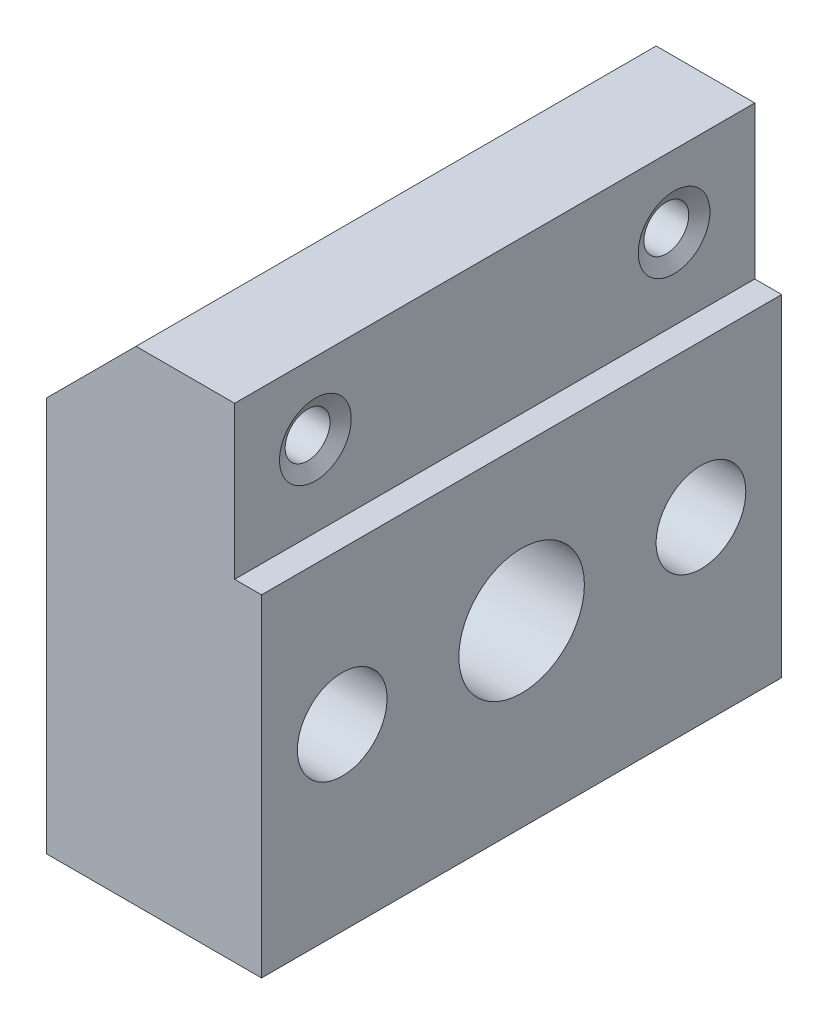
ISO-10303-21;
HEADER;
FILE_DESCRIPTION(('STEP AP214'),'2;1');
FILE_NAME('part.step','',(''),(''),'','','');
FILE_SCHEMA(('AUTOMOTIVE_DESIGN { 1 0 10303 214 1 1 1 1 }'));
ENDSEC;
DATA;
#1=APPLICATION_CONTEXT('core data for automotive mechanical design processes');
#2=APPLICATION_PROTOCOL_DEFINITION('international standard','automotive_design',2000,#1);
#3=PRODUCT_CONTEXT('',#1,'mechanical');
#4=PRODUCT('Part','Part','',(#3));
#5=PRODUCT_RELATED_PRODUCT_CATEGORY('part','',(#4));
#6=PRODUCT_DEFINITION_FORMATION('','',#4);
#7=PRODUCT_DEFINITION_CONTEXT('part definition',#1,'design');
#8=PRODUCT_DEFINITION('design','',#6,#7);
#9=PRODUCT_DEFINITION_SHAPE('','',#8);
#10=(LENGTH_UNIT() NAMED_UNIT(*) SI_UNIT(.MILLI.,.METRE.));
#11=(NAMED_UNIT(*) PLANE_ANGLE_UNIT() SI_UNIT($,.RADIAN.));
#12=(NAMED_UNIT(*) SI_UNIT($,.STERADIAN.) SOLID_ANGLE_UNIT());
#13=UNCERTAINTY_MEASURE_WITH_UNIT(LENGTH_MEASURE(1.E-05),#10,'distance_accuracy_value','');
#14=(GEOMETRIC_REPRESENTATION_CONTEXT(3) GLOBAL_UNCERTAINTY_ASSIGNED_CONTEXT((#13)) GLOBAL_UNIT_ASSIGNED_CONTEXT((#10,
#11,#12)) REPRESENTATION_CONTEXT('',''));
#15=CARTESIAN_POINT('',(0.,0.,0.));
#16=DIRECTION('',(0.,0.,1.));
#17=DIRECTION('',(1.,0.,0.));
#18=AXIS2_PLACEMENT_3D('',#15,#16,#17);
#19=CARTESIAN_POINT('',(-24.,0.,58.));
#20=DIRECTION('',(0.,1.,0.));
#21=DIRECTION('',(0.,0.,1.));
#22=AXIS2_PLACEMENT_3D('',#19,#20,#21);
#23=PLANE('',#22);
#24=DIRECTION('',(1.,0.,0.));
#25=VECTOR('',#24,1.);
#26=CARTESIAN_POINT('',(-24.,0.,0.));
#27=LINE('',#26,#25);
#28=CARTESIAN_POINT('',(-24.,0.,0.));
#29=VERTEX_POINT('',#28);
#30=CARTESIAN_POINT('',(0.,0.,0.));
#31=VERTEX_POINT('',#30);
#32=EDGE_CURVE('E131',#29,#31,#27,.T.);
#33=ORIENTED_EDGE('',*,*,#32,.T.);
#34=DIRECTION('',(0.,0.,-1.));
#35=VECTOR('',#34,1.);
#36=CARTESIAN_POINT('',(0.,0.,58.));
#37=LINE('',#36,#35);
#38=CARTESIAN_POINT('',(0.,0.,58.));
#39=VERTEX_POINT('',#38);
#40=EDGE_CURVE('E11',#39,#31,#37,.T.);
#41=ORIENTED_EDGE('',*,*,#40,.F.);
#42=DIRECTION('',(1.,0.,0.));
#43=VECTOR('',#42,1.);
#44=CARTESIAN_POINT('',(-24.,0.,58.));
#45=LINE('',#44,#43);
#46=CARTESIAN_POINT('',(-24.,0.,58.));
#47=VERTEX_POINT('',#46);
#48=EDGE_CURVE('E144',#47,#39,#45,.T.);
#49=ORIENTED_EDGE('',*,*,#48,.F.);
#50=DIRECTION('',(0.,0.,-1.));
#51=VECTOR('',#50,1.);
#52=CARTESIAN_POINT('',(-24.,0.,58.));
#53=LINE('',#52,#51);
#54=EDGE_CURVE('E127',#47,#29,#53,.T.);
#55=ORIENTED_EDGE('',*,*,#54,.T.);
#56=EDGE_LOOP('',(#33,#41,#49,#55));
#57=FACE_BOUND('',#56,.T.);
#58=ADVANCED_FACE('F38',(#57),#23,.F.);
#59=CARTESIAN_POINT('',(0.,0.,58.));
#60=DIRECTION('',(-1.,0.,0.));
#61=DIRECTION('',(0.,0.,1.));
#62=AXIS2_PLACEMENT_3D('',#59,#60,#61);
#63=PLANE('',#62);
#64=CARTESIAN_POINT('',(0.,20.,29.));
#65=DIRECTION('',(1.,0.,0.));
#66=DIRECTION('',(0.,0.,-1.));
#67=AXIS2_PLACEMENT_3D('',#64,#65,#66);
#68=CIRCLE('',#67,7.);
#69=CARTESIAN_POINT('',(0.,20.,22.));
#70=VERTEX_POINT('',#69);
#71=EDGE_CURVE('E181',#70,#70,#68,.T.);
#72=ORIENTED_EDGE('',*,*,#71,.F.);
#73=EDGE_LOOP('',(#72));
#74=FACE_BOUND('',#73,.T.);
#75=CARTESIAN_POINT('',(0.,20.,49.));
#76=DIRECTION('',(1.,0.,0.));
#77=DIRECTION('',(0.,0.,1.));
#78=AXIS2_PLACEMENT_3D('',#75,#76,#77);
#79=CIRCLE('',#78,5.);
#80=CARTESIAN_POINT('',(0.,20.,54.));
#81=VERTEX_POINT('',#80);
#82=EDGE_CURVE('E173',#81,#81,#79,.T.);
#83=ORIENTED_EDGE('',*,*,#82,.F.);
#84=EDGE_LOOP('',(#83));
#85=FACE_BOUND('',#84,.T.);
#86=CARTESIAN_POINT('',(0.,20.,9.));
#87=DIRECTION('',(1.,0.,0.));
#88=DIRECTION('',(0.,0.,-1.));
#89=AXIS2_PLACEMENT_3D('',#86,#87,#88);
#90=CIRCLE('',#89,5.);
#91=CARTESIAN_POINT('',(0.,20.,4.));
#92=VERTEX_POINT('',#91);
#93=EDGE_CURVE('E167',#92,#92,#90,.T.);
#94=ORIENTED_EDGE('',*,*,#93,.F.);
#95=EDGE_LOOP('',(#94));
#96=FACE_BOUND('',#95,.T.);
#97=DIRECTION('',(0.,1.,0.));
#98=VECTOR('',#97,1.);
#99=CARTESIAN_POINT('',(0.,0.,0.));
#100=LINE('',#99,#98);
#101=CARTESIAN_POINT('',(0.,37.,0.));
#102=VERTEX_POINT('',#101);
#103=EDGE_CURVE('E134',#31,#102,#100,.T.);
#104=ORIENTED_EDGE('',*,*,#103,.T.);
#105=DIRECTION('',(0.,0.,-1.));
#106=VECTOR('',#105,1.);
#107=CARTESIAN_POINT('',(0.,37.,58.));
#108=LINE('',#107,#106);
#109=CARTESIAN_POINT('',(0.,37.,58.));
#110=VERTEX_POINT('',#109);
#111=EDGE_CURVE('E46',#110,#102,#108,.T.);
#112=ORIENTED_EDGE('',*,*,#111,.F.);
#113=DIRECTION('',(0.,1.,0.));
#114=VECTOR('',#113,1.);
#115=CARTESIAN_POINT('',(0.,0.,58.));
#116=LINE('',#115,#114);
#117=EDGE_CURVE('E95',#39,#110,#116,.T.);
#118=ORIENTED_EDGE('',*,*,#117,.F.);
#119=ORIENTED_EDGE('',*,*,#40,.T.);
#120=EDGE_LOOP('',(#104,#112,#118,#119));
#121=FACE_BOUND('',#120,.T.);
#122=ADVANCED_FACE('F228',(#74,#85,#96,#121),#63,.F.);
#123=CARTESIAN_POINT('',(0.,37.,58.));
#124=DIRECTION('',(0.,-1.,0.));
#125=DIRECTION('',(0.,0.,-1.));
#126=AXIS2_PLACEMENT_3D('',#123,#124,#125);
#127=PLANE('',#126);
#128=DIRECTION('',(-1.,0.,0.));
#129=VECTOR('',#128,1.);
#130=CARTESIAN_POINT('',(0.,37.,0.));
#131=LINE('',#130,#129);
#132=CARTESIAN_POINT('',(-3.,37.,0.));
#133=VERTEX_POINT('',#132);
#134=EDGE_CURVE('E137',#102,#133,#131,.T.);
#135=ORIENTED_EDGE('',*,*,#134,.T.);
#136=DIRECTION('',(0.,0.,-1.));
#137=VECTOR('',#136,1.);
#138=CARTESIAN_POINT('',(-3.,37.,58.));
#139=LINE('',#138,#137);
#140=CARTESIAN_POINT('',(-3.,37.,58.));
#141=VERTEX_POINT('',#140);
#142=EDGE_CURVE('E148',#141,#133,#139,.T.);
#143=ORIENTED_EDGE('',*,*,#142,.F.);
#144=DIRECTION('',(-1.,0.,0.));
#145=VECTOR('',#144,1.);
#146=CARTESIAN_POINT('',(0.,37.,58.));
#147=LINE('',#146,#145);
#148=EDGE_CURVE('E156',#110,#141,#147,.T.);
#149=ORIENTED_EDGE('',*,*,#148,.F.);
#150=ORIENTED_EDGE('',*,*,#111,.T.);
#151=EDGE_LOOP('',(#135,#143,#149,#150));
#152=FACE_BOUND('',#151,.T.);
#153=ADVANCED_FACE('F154',(#152),#127,.F.);
#154=CARTESIAN_POINT('',(-3.,37.,58.));
#155=DIRECTION('',(-1.,0.,0.));
#156=DIRECTION('',(0.,0.,1.));
#157=AXIS2_PLACEMENT_3D('',#154,#155,#156);
#158=PLANE('',#157);
#159=CARTESIAN_POINT('',(-3.,46.,49.));
#160=DIRECTION('',(1.,0.,0.));
#161=DIRECTION('',(0.,0.,-1.));
#162=AXIS2_PLACEMENT_3D('',#159,#160,#161);
#163=CIRCLE('',#162,4.);
#164=CARTESIAN_POINT('',(-3.,46.,45.));
#165=VERTEX_POINT('',#164);
#166=EDGE_CURVE('E199',#165,#165,#163,.T.);
#167=ORIENTED_EDGE('',*,*,#166,.F.);
#168=EDGE_LOOP('',(#167));
#169=FACE_BOUND('',#168,.T.);
#170=CARTESIAN_POINT('',(-3.,46.,9.));
#171=DIRECTION('',(1.,0.,0.));
#172=DIRECTION('',(0.,0.,-1.));
#173=AXIS2_PLACEMENT_3D('',#170,#171,#172);
#174=CIRCLE('',#173,4.);
#175=CARTESIAN_POINT('',(-3.,46.,5.));
#176=VERTEX_POINT('',#175);
#177=EDGE_CURVE('E190',#176,#176,#174,.T.);
#178=ORIENTED_EDGE('',*,*,#177,.F.);
#179=EDGE_LOOP('',(#178));
#180=FACE_BOUND('',#179,.T.);
#181=DIRECTION('',(0.,1.,0.));
#182=VECTOR('',#181,1.);
#183=CARTESIAN_POINT('',(-3.,37.,0.));
#184=LINE('',#183,#182);
#185=CARTESIAN_POINT('',(-3.,54.,0.));
#186=VERTEX_POINT('',#185);
#187=EDGE_CURVE('E139',#133,#186,#184,.T.);
#188=ORIENTED_EDGE('',*,*,#187,.T.);
#189=DIRECTION('',(0.,0.,-1.));
#190=VECTOR('',#189,1.);
#191=CARTESIAN_POINT('',(-3.,54.,58.));
#192=LINE('',#191,#190);
#193=CARTESIAN_POINT('',(-3.,54.,58.));
#194=VERTEX_POINT('',#193);
#195=EDGE_CURVE('E122',#194,#186,#192,.T.);
#196=ORIENTED_EDGE('',*,*,#195,.F.);
#197=DIRECTION('',(0.,1.,0.));
#198=VECTOR('',#197,1.);
#199=CARTESIAN_POINT('',(-3.,37.,58.));
#200=LINE('',#199,#198);
#201=EDGE_CURVE('E113',#141,#194,#200,.T.);
#202=ORIENTED_EDGE('',*,*,#201,.F.);
#203=ORIENTED_EDGE('',*,*,#142,.T.);
#204=EDGE_LOOP('',(#188,#196,#202,#203));
#205=FACE_BOUND('',#204,.T.);
#206=ADVANCED_FACE('F162',(#169,#180,#205),#158,.F.);
#207=CARTESIAN_POINT('',(-3.,54.,58.));
#208=DIRECTION('',(0.,-1.,0.));
#209=DIRECTION('',(0.,0.,-1.));
#210=AXIS2_PLACEMENT_3D('',#207,#208,#209);
#211=PLANE('',#210);
#212=DIRECTION('',(-1.,0.,0.));
#213=VECTOR('',#212,1.);
#214=CARTESIAN_POINT('',(-3.,54.,0.));
#215=LINE('',#214,#213);
#216=CARTESIAN_POINT('',(-14.,54.,0.));
#217=VERTEX_POINT('',#216);
#218=EDGE_CURVE('E121',#186,#217,#215,.T.);
#219=ORIENTED_EDGE('',*,*,#218,.T.);
#220=DIRECTION('',(0.,0.,-1.));
#221=VECTOR('',#220,1.);
#222=CARTESIAN_POINT('',(-14.,54.,58.));
#223=LINE('',#222,#221);
#224=CARTESIAN_POINT('',(-14.,54.,58.));
#225=VERTEX_POINT('',#224);
#226=EDGE_CURVE('E118',#225,#217,#223,.T.);
#227=ORIENTED_EDGE('',*,*,#226,.F.);
#228=DIRECTION('',(-1.,0.,0.));
#229=VECTOR('',#228,1.);
#230=CARTESIAN_POINT('',(-3.,54.,58.));
#231=LINE('',#230,#229);
#232=EDGE_CURVE('E107',#194,#225,#231,.T.);
#233=ORIENTED_EDGE('',*,*,#232,.F.);
#234=ORIENTED_EDGE('',*,*,#195,.T.);
#235=EDGE_LOOP('',(#219,#227,#233,#234));
#236=FACE_BOUND('',#235,.T.);
#237=ADVANCED_FACE('F119',(#236),#211,.F.);
#238=CARTESIAN_POINT('',(-14.,54.,58.));
#239=DIRECTION('',(0.707106781186548,-0.707106781186547,0.));
#240=DIRECTION('',(0.707106781186547,0.707106781186548,0.));
#241=AXIS2_PLACEMENT_3D('',#238,#239,#240);
#242=PLANE('',#241);
#243=DIRECTION('',(-0.707106781186547,-0.707106781186548,0.));
#244=VECTOR('',#243,1.);
#245=CARTESIAN_POINT('',(-14.,54.,0.));
#246=LINE('',#245,#244);
#247=CARTESIAN_POINT('',(-24.,44.,0.));
#248=VERTEX_POINT('',#247);
#249=EDGE_CURVE('E81',#217,#248,#246,.T.);
#250=ORIENTED_EDGE('',*,*,#249,.T.);
#251=DIRECTION('',(0.,0.,-1.));
#252=VECTOR('',#251,1.);
#253=CARTESIAN_POINT('',(-24.,44.,58.));
#254=LINE('',#253,#252);
#255=CARTESIAN_POINT('',(-24.,44.,58.));
#256=VERTEX_POINT('',#255);
#257=EDGE_CURVE('E123',#256,#248,#254,.T.);
#258=ORIENTED_EDGE('',*,*,#257,.F.);
#259=DIRECTION('',(-0.707106781186547,-0.707106781186548,0.));
#260=VECTOR('',#259,1.);
#261=CARTESIAN_POINT('',(-14.,54.,58.));
#262=LINE('',#261,#260);
#263=EDGE_CURVE('E111',#225,#256,#262,.T.);
#264=ORIENTED_EDGE('',*,*,#263,.F.);
#265=ORIENTED_EDGE('',*,*,#226,.T.);
#266=EDGE_LOOP('',(#250,#258,#264,#265));
#267=FACE_BOUND('',#266,.T.);
#268=ADVANCED_FACE('F125',(#267),#242,.F.);
#269=CARTESIAN_POINT('',(-24.,44.,58.));
#270=DIRECTION('',(1.,0.,0.));
#271=DIRECTION('',(0.,0.,-1.));
#272=AXIS2_PLACEMENT_3D('',#269,#270,#271);
#273=PLANE('',#272);
#274=CARTESIAN_POINT('',(-24.,20.,29.));
#275=DIRECTION('',(1.,0.,0.));
#276=DIRECTION('',(0.,0.,-1.));
#277=AXIS2_PLACEMENT_3D('',#274,#275,#276);
#278=CIRCLE('',#277,6.99999999999999);
#279=CARTESIAN_POINT('',(-24.,20.,22.));
#280=VERTEX_POINT('',#279);
#281=EDGE_CURVE('E176',#280,#280,#278,.T.);
#282=ORIENTED_EDGE('',*,*,#281,.T.);
#283=EDGE_LOOP('',(#282));
#284=FACE_BOUND('',#283,.T.);
#285=CARTESIAN_POINT('',(-24.,20.,49.));
#286=DIRECTION('',(1.,0.,0.));
#287=DIRECTION('',(0.,0.,1.));
#288=AXIS2_PLACEMENT_3D('',#285,#286,#287);
#289=CIRCLE('',#288,5.);
#290=CARTESIAN_POINT('',(-24.,20.,54.));
#291=VERTEX_POINT('',#290);
#292=EDGE_CURVE('E170',#291,#291,#289,.T.);
#293=ORIENTED_EDGE('',*,*,#292,.T.);
#294=EDGE_LOOP('',(#293));
#295=FACE_BOUND('',#294,.T.);
#296=CARTESIAN_POINT('',(-24.,20.,9.));
#297=DIRECTION('',(1.,0.,0.));
#298=DIRECTION('',(0.,0.,-1.));
#299=AXIS2_PLACEMENT_3D('',#296,#297,#298);
#300=CIRCLE('',#299,5.);
#301=CARTESIAN_POINT('',(-24.,20.,4.));
#302=VERTEX_POINT('',#301);
#303=EDGE_CURVE('E135',#302,#302,#300,.T.);
#304=ORIENTED_EDGE('',*,*,#303,.T.);
#305=EDGE_LOOP('',(#304));
#306=FACE_BOUND('',#305,.T.);
#307=DIRECTION('',(0.,-1.,0.));
#308=VECTOR('',#307,1.);
#309=CARTESIAN_POINT('',(-24.,44.,0.));
#310=LINE('',#309,#308);
#311=EDGE_CURVE('E87',#248,#29,#310,.T.);
#312=ORIENTED_EDGE('',*,*,#311,.T.);
#313=ORIENTED_EDGE('',*,*,#54,.F.);
#314=DIRECTION('',(0.,-1.,0.));
#315=VECTOR('',#314,1.);
#316=CARTESIAN_POINT('',(-24.,44.,58.));
#317=LINE('',#316,#315);
#318=EDGE_CURVE('E54',#256,#47,#317,.T.);
#319=ORIENTED_EDGE('',*,*,#318,.F.);
#320=ORIENTED_EDGE('',*,*,#257,.T.);
#321=EDGE_LOOP('',(#312,#313,#319,#320));
#322=FACE_BOUND('',#321,.T.);
#323=ADVANCED_FACE('F236',(#284,#295,#306,#322),#273,.F.);
#324=CARTESIAN_POINT('',(0.,0.,58.));
#325=DIRECTION('',(0.,0.,1.));
#326=DIRECTION('',(1.,0.,0.));
#327=AXIS2_PLACEMENT_3D('',#324,#325,#326);
#328=PLANE('',#327);
#329=ORIENTED_EDGE('',*,*,#48,.T.);
#330=ORIENTED_EDGE('',*,*,#117,.T.);
#331=ORIENTED_EDGE('',*,*,#148,.T.);
#332=ORIENTED_EDGE('',*,*,#201,.T.);
#333=ORIENTED_EDGE('',*,*,#232,.T.);
#334=ORIENTED_EDGE('',*,*,#263,.T.);
#335=ORIENTED_EDGE('',*,*,#318,.T.);
#336=EDGE_LOOP('',(#329,#330,#331,#332,#333,#334,#335));
#337=FACE_BOUND('',#336,.T.);
#338=ADVANCED_FACE('F109',(#337),#328,.T.);
#339=CARTESIAN_POINT('',(0.,0.,0.));
#340=DIRECTION('',(0.,0.,1.));
#341=DIRECTION('',(1.,0.,0.));
#342=AXIS2_PLACEMENT_3D('',#339,#340,#341);
#343=PLANE('',#342);
#344=ORIENTED_EDGE('',*,*,#32,.F.);
#345=ORIENTED_EDGE('',*,*,#311,.F.);
#346=ORIENTED_EDGE('',*,*,#249,.F.);
#347=ORIENTED_EDGE('',*,*,#218,.F.);
#348=ORIENTED_EDGE('',*,*,#187,.F.);
#349=ORIENTED_EDGE('',*,*,#134,.F.);
#350=ORIENTED_EDGE('',*,*,#103,.F.);
#351=EDGE_LOOP('',(#344,#345,#346,#347,#348,#349,#350));
#352=FACE_BOUND('',#351,.T.);
#353=ADVANCED_FACE('F160',(#352),#343,.F.);
#354=CARTESIAN_POINT('',(-24.,20.,9.));
#355=DIRECTION('',(1.,0.,0.));
#356=DIRECTION('',(0.,0.,-1.));
#357=AXIS2_PLACEMENT_3D('',#354,#355,#356);
#358=CYLINDRICAL_SURFACE('',#357,5.);
#359=ORIENTED_EDGE('',*,*,#303,.F.);
#360=EDGE_LOOP('',(#359));
#361=FACE_BOUND('',#360,.T.);
#362=ORIENTED_EDGE('',*,*,#93,.T.);
#363=EDGE_LOOP('',(#362));
#364=FACE_BOUND('',#363,.T.);
#365=ADVANCED_FACE('F285',(#361,#364),#358,.F.);
#366=CARTESIAN_POINT('',(-24.,20.,49.));
#367=DIRECTION('',(1.,0.,0.));
#368=DIRECTION('',(0.,0.,-1.));
#369=AXIS2_PLACEMENT_3D('',#366,#367,#368);
#370=CYLINDRICAL_SURFACE('',#369,5.);
#371=ORIENTED_EDGE('',*,*,#292,.F.);
#372=EDGE_LOOP('',(#371));
#373=FACE_BOUND('',#372,.T.);
#374=ORIENTED_EDGE('',*,*,#82,.T.);
#375=EDGE_LOOP('',(#374));
#376=FACE_BOUND('',#375,.T.);
#377=ADVANCED_FACE('F293',(#373,#376),#370,.F.);
#378=CARTESIAN_POINT('',(0.,20.,29.));
#379=DIRECTION('',(1.,0.,0.));
#380=DIRECTION('',(0.,0.,-1.));
#381=AXIS2_PLACEMENT_3D('',#378,#379,#380);
#382=CYLINDRICAL_SURFACE('',#381,6.99999999999999);
#383=ORIENTED_EDGE('',*,*,#281,.F.);
#384=EDGE_LOOP('',(#383));
#385=FACE_BOUND('',#384,.T.);
#386=ORIENTED_EDGE('',*,*,#71,.T.);
#387=EDGE_LOOP('',(#386));
#388=FACE_BOUND('',#387,.T.);
#389=ADVANCED_FACE('F302',(#385,#388),#382,.F.);
#390=CARTESIAN_POINT('',(-18.,46.,9.));
#391=DIRECTION('',(1.,0.,0.));
#392=DIRECTION('',(0.,0.,-1.));
#393=AXIS2_PLACEMENT_3D('',#390,#391,#392);
#394=CONICAL_SURFACE('',#393,2.49999999999999,1.02974425867665);
#395=CARTESIAN_POINT('',(-19.5021515475689,46.,9.));
#396=VERTEX_POINT('',#395);
#397=VERTEX_LOOP('',#396);
#398=FACE_BOUND('',#397,.T.);
#399=CARTESIAN_POINT('',(-18.,46.,9.));
#400=DIRECTION('',(1.,0.,0.));
#401=DIRECTION('',(0.,0.,-1.));
#402=AXIS2_PLACEMENT_3D('',#399,#400,#401);
#403=CIRCLE('',#402,2.49999999999999);
#404=CARTESIAN_POINT('',(-18.,46.,6.50000000000001));
#405=VERTEX_POINT('',#404);
#406=EDGE_CURVE('E184',#405,#405,#403,.T.);
#407=ORIENTED_EDGE('',*,*,#406,.T.);
#408=EDGE_LOOP('',(#407));
#409=FACE_BOUND('',#408,.T.);
#410=ADVANCED_FACE('F223',(#398,#409),#394,.F.);
#411=CARTESIAN_POINT('',(-3.,46.,9.));
#412=DIRECTION('',(1.,0.,0.));
#413=DIRECTION('',(0.,0.,-1.));
#414=AXIS2_PLACEMENT_3D('',#411,#412,#413);
#415=CYLINDRICAL_SURFACE('',#414,2.49999999999999);
#416=ORIENTED_EDGE('',*,*,#406,.F.);
#417=EDGE_LOOP('',(#416));
#418=FACE_BOUND('',#417,.T.);
#419=CARTESIAN_POINT('',(-3.86602540378443,46.,9.));
#420=DIRECTION('',(1.,0.,0.));
#421=DIRECTION('',(0.,0.,-1.));
#422=AXIS2_PLACEMENT_3D('',#419,#420,#421);
#423=CIRCLE('',#422,2.5);
#424=CARTESIAN_POINT('',(-3.86602540378443,46.,6.50000000000001));
#425=VERTEX_POINT('',#424);
#426=EDGE_CURVE('E187',#425,#425,#423,.T.);
#427=ORIENTED_EDGE('',*,*,#426,.T.);
#428=EDGE_LOOP('',(#427));
#429=FACE_BOUND('',#428,.T.);
#430=ADVANCED_FACE('F213',(#418,#429),#415,.F.);
#431=CARTESIAN_POINT('',(-3.,46.,9.));
#432=DIRECTION('',(1.,0.,0.));
#433=DIRECTION('',(0.,0.,-1.));
#434=AXIS2_PLACEMENT_3D('',#431,#432,#433);
#435=CONICAL_SURFACE('',#434,4.,1.0471975511966);
#436=ORIENTED_EDGE('',*,*,#426,.F.);
#437=EDGE_LOOP('',(#436));
#438=FACE_BOUND('',#437,.T.);
#439=ORIENTED_EDGE('',*,*,#177,.T.);
#440=EDGE_LOOP('',(#439));
#441=FACE_BOUND('',#440,.T.);
#442=ADVANCED_FACE('F210',(#438,#441),#435,.F.);
#443=CARTESIAN_POINT('',(-18.,46.,49.));
#444=DIRECTION('',(1.,0.,0.));
#445=DIRECTION('',(0.,0.,-1.));
#446=AXIS2_PLACEMENT_3D('',#443,#444,#445);
#447=CONICAL_SURFACE('',#446,2.49999999999999,1.02974425867665);
#448=CARTESIAN_POINT('',(-19.5021515475689,46.,49.));
#449=VERTEX_POINT('',#448);
#450=VERTEX_LOOP('',#449);
#451=FACE_BOUND('',#450,.T.);
#452=CARTESIAN_POINT('',(-18.,46.,49.));
#453=DIRECTION('',(1.,0.,0.));
#454=DIRECTION('',(0.,0.,-1.));
#455=AXIS2_PLACEMENT_3D('',#452,#453,#454);
#456=CIRCLE('',#455,2.49999999999999);
#457=CARTESIAN_POINT('',(-18.,46.,46.5));
#458=VERTEX_POINT('',#457);
#459=EDGE_CURVE('E193',#458,#458,#456,.T.);
#460=ORIENTED_EDGE('',*,*,#459,.T.);
#461=EDGE_LOOP('',(#460));
#462=FACE_BOUND('',#461,.T.);
#463=ADVANCED_FACE('F212',(#451,#462),#447,.F.);
#464=CARTESIAN_POINT('',(-3.,46.,49.));
#465=DIRECTION('',(1.,0.,0.));
#466=DIRECTION('',(0.,0.,-1.));
#467=AXIS2_PLACEMENT_3D('',#464,#465,#466);
#468=CYLINDRICAL_SURFACE('',#467,2.49999999999999);
#469=ORIENTED_EDGE('',*,*,#459,.F.);
#470=EDGE_LOOP('',(#469));
#471=FACE_BOUND('',#470,.T.);
#472=CARTESIAN_POINT('',(-3.86602540378443,46.,49.));
#473=DIRECTION('',(1.,0.,0.));
#474=DIRECTION('',(0.,0.,-1.));
#475=AXIS2_PLACEMENT_3D('',#472,#473,#474);
#476=CIRCLE('',#475,2.5);
#477=CARTESIAN_POINT('',(-3.86602540378443,46.,46.5));
#478=VERTEX_POINT('',#477);
#479=EDGE_CURVE('E196',#478,#478,#476,.T.);
#480=ORIENTED_EDGE('',*,*,#479,.T.);
#481=EDGE_LOOP('',(#480));
#482=FACE_BOUND('',#481,.T.);
#483=ADVANCED_FACE('F220',(#471,#482),#468,.F.);
#484=CARTESIAN_POINT('',(-3.,46.,49.));
#485=DIRECTION('',(1.,0.,0.));
#486=DIRECTION('',(0.,0.,-1.));
#487=AXIS2_PLACEMENT_3D('',#484,#485,#486);
#488=CONICAL_SURFACE('',#487,4.,1.0471975511966);
#489=ORIENTED_EDGE('',*,*,#479,.F.);
#490=EDGE_LOOP('',(#489));
#491=FACE_BOUND('',#490,.T.);
#492=ORIENTED_EDGE('',*,*,#166,.T.);
#493=EDGE_LOOP('',(#492));
#494=FACE_BOUND('',#493,.T.);
#495=ADVANCED_FACE('F203',(#491,#494),#488,.F.);
#496=CLOSED_SHELL('',(#58,#122,#153,#206,#237,#268,#323,#338,#353,#365,#377,#389,#410,#430,#442,
#463,#483,#495));
#497=MANIFOLD_SOLID_BREP('B2',#496);
#498=ADVANCED_BREP_SHAPE_REPRESENTATION('',(#18,#497),#14);
#499=SHAPE_DEFINITION_REPRESENTATION(#9,#498);
ENDSEC;
END-ISO-10303-21;
